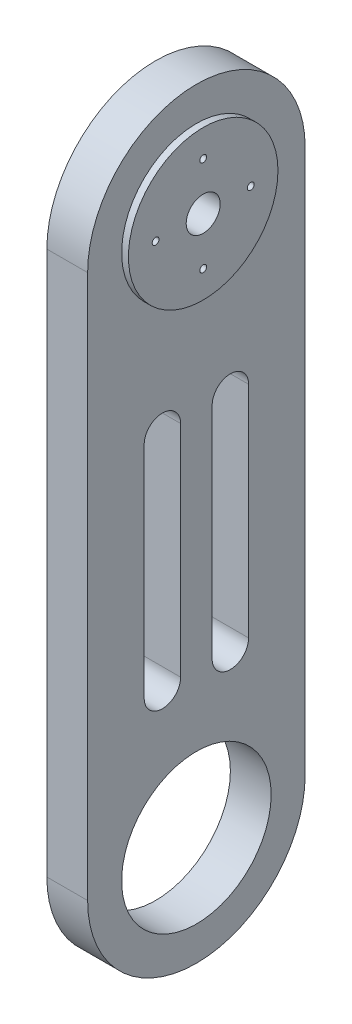
ISO-10303-21;
HEADER;
FILE_DESCRIPTION(('STEP AP214'),'2;1');
FILE_NAME('part.step','',(''),(''),'','','');
FILE_SCHEMA(('AUTOMOTIVE_DESIGN { 1 0 10303 214 1 1 1 1 }'));
ENDSEC;
DATA;
#1=APPLICATION_CONTEXT('core data for automotive mechanical design processes');
#2=APPLICATION_PROTOCOL_DEFINITION('international standard','automotive_design',2000,#1);
#3=PRODUCT_CONTEXT('',#1,'mechanical');
#4=PRODUCT('Part','Part','',(#3));
#5=PRODUCT_RELATED_PRODUCT_CATEGORY('part','',(#4));
#6=PRODUCT_DEFINITION_FORMATION('','',#4);
#7=PRODUCT_DEFINITION_CONTEXT('part definition',#1,'design');
#8=PRODUCT_DEFINITION('design','',#6,#7);
#9=PRODUCT_DEFINITION_SHAPE('','',#8);
#10=(LENGTH_UNIT() NAMED_UNIT(*) SI_UNIT(.MILLI.,.METRE.));
#11=(NAMED_UNIT(*) PLANE_ANGLE_UNIT() SI_UNIT($,.RADIAN.));
#12=(NAMED_UNIT(*) SI_UNIT($,.STERADIAN.) SOLID_ANGLE_UNIT());
#13=UNCERTAINTY_MEASURE_WITH_UNIT(LENGTH_MEASURE(1.E-05),#10,'distance_accuracy_value','');
#14=(GEOMETRIC_REPRESENTATION_CONTEXT(3) GLOBAL_UNCERTAINTY_ASSIGNED_CONTEXT((#13)) GLOBAL_UNIT_ASSIGNED_CONTEXT((#10,
#11,#12)) REPRESENTATION_CONTEXT('',''));
#15=CARTESIAN_POINT('',(0.,0.,0.));
#16=DIRECTION('',(0.,0.,1.));
#17=DIRECTION('',(1.,0.,0.));
#18=AXIS2_PLACEMENT_3D('',#15,#16,#17);
#19=CARTESIAN_POINT('',(-2.,0.,0.));
#20=DIRECTION('',(1.,0.,0.));
#21=DIRECTION('',(0.,0.,-1.));
#22=AXIS2_PLACEMENT_3D('',#19,#20,#21);
#23=PLANE('',#22);
#24=CARTESIAN_POINT('',(-2.,7.,0.));
#25=DIRECTION('',(-1.,0.,0.));
#26=DIRECTION('',(0.,0.,1.));
#27=AXIS2_PLACEMENT_3D('',#24,#25,#26);
#28=CIRCLE('',#27,0.5);
#29=CARTESIAN_POINT('',(-2.,7.,0.499999999999998));
#30=VERTEX_POINT('',#29);
#31=EDGE_CURVE('E312',#30,#30,#28,.T.);
#32=ORIENTED_EDGE('',*,*,#31,.F.);
#33=EDGE_LOOP('',(#32));
#34=FACE_BOUND('',#33,.T.);
#35=CARTESIAN_POINT('',(-2.,0.,-7.));
#36=DIRECTION('',(-1.,0.,0.));
#37=DIRECTION('',(0.,0.,1.));
#38=AXIS2_PLACEMENT_3D('',#35,#36,#37);
#39=CIRCLE('',#38,0.500000000000001);
#40=CARTESIAN_POINT('',(-2.,0.,-6.5));
#41=VERTEX_POINT('',#40);
#42=EDGE_CURVE('E413',#41,#41,#39,.T.);
#43=ORIENTED_EDGE('',*,*,#42,.F.);
#44=EDGE_LOOP('',(#43));
#45=FACE_BOUND('',#44,.T.);
#46=CARTESIAN_POINT('',(-2.,0.,7.));
#47=DIRECTION('',(-1.,0.,0.));
#48=DIRECTION('',(0.,0.,1.));
#49=AXIS2_PLACEMENT_3D('',#46,#47,#48);
#50=CIRCLE('',#49,0.500000000000001);
#51=CARTESIAN_POINT('',(-2.,0.,7.5));
#52=VERTEX_POINT('',#51);
#53=EDGE_CURVE('E412',#52,#52,#50,.T.);
#54=ORIENTED_EDGE('',*,*,#53,.F.);
#55=EDGE_LOOP('',(#54));
#56=FACE_BOUND('',#55,.T.);
#57=CARTESIAN_POINT('',(-2.,-7.,0.));
#58=DIRECTION('',(-1.,0.,0.));
#59=DIRECTION('',(0.,0.,1.));
#60=AXIS2_PLACEMENT_3D('',#57,#58,#59);
#61=CIRCLE('',#60,0.5);
#62=CARTESIAN_POINT('',(-2.,-7.,0.500000000000002));
#63=VERTEX_POINT('',#62);
#64=EDGE_CURVE('E418',#63,#63,#61,.T.);
#65=ORIENTED_EDGE('',*,*,#64,.F.);
#66=EDGE_LOOP('',(#65));
#67=FACE_BOUND('',#66,.T.);
#68=CARTESIAN_POINT('',(-2.,0.,0.));
#69=DIRECTION('',(1.,0.,0.));
#70=DIRECTION('',(0.,0.,-1.));
#71=AXIS2_PLACEMENT_3D('',#68,#69,#70);
#72=CIRCLE('',#71,11.);
#73=CARTESIAN_POINT('',(-2.,0.,-11.));
#74=VERTEX_POINT('',#73);
#75=EDGE_CURVE('E11',#74,#74,#72,.F.);
#76=ORIENTED_EDGE('',*,*,#75,.T.);
#77=EDGE_LOOP('',(#76));
#78=FACE_BOUND('',#77,.T.);
#79=CARTESIAN_POINT('',(-2.,0.,0.));
#80=DIRECTION('',(-1.,0.,0.));
#81=DIRECTION('',(0.,0.,1.));
#82=AXIS2_PLACEMENT_3D('',#79,#80,#81);
#83=CIRCLE('',#82,2.5);
#84=CARTESIAN_POINT('',(-2.,0.,2.5));
#85=VERTEX_POINT('',#84);
#86=EDGE_CURVE('E305',#85,#85,#83,.T.);
#87=ORIENTED_EDGE('',*,*,#86,.F.);
#88=EDGE_LOOP('',(#87));
#89=FACE_BOUND('',#88,.T.);
#90=ADVANCED_FACE('F38',(#34,#45,#56,#67,#78,#89),#23,.F.);
#91=CARTESIAN_POINT('',(-3.,0.,0.));
#92=DIRECTION('',(1.,0.,0.));
#93=DIRECTION('',(0.,0.,-1.));
#94=AXIS2_PLACEMENT_3D('',#91,#92,#93);
#95=CYLINDRICAL_SURFACE('',#94,11.);
#96=CARTESIAN_POINT('',(-3.,0.,0.));
#97=DIRECTION('',(1.,0.,0.));
#98=DIRECTION('',(0.,0.,-1.));
#99=AXIS2_PLACEMENT_3D('',#96,#97,#98);
#100=CIRCLE('',#99,11.);
#101=CARTESIAN_POINT('',(-3.,0.,-11.));
#102=VERTEX_POINT('',#101);
#103=EDGE_CURVE('E212',#102,#102,#100,.T.);
#104=ORIENTED_EDGE('',*,*,#103,.F.);
#105=EDGE_LOOP('',(#104));
#106=FACE_BOUND('',#105,.T.);
#107=ORIENTED_EDGE('',*,*,#75,.F.);
#108=EDGE_LOOP('',(#107));
#109=FACE_BOUND('',#108,.T.);
#110=ADVANCED_FACE('F259',(#106,#109),#95,.F.);
#111=CARTESIAN_POINT('',(-3.,-80.,0.));
#112=DIRECTION('',(1.,0.,0.));
#113=DIRECTION('',(0.,0.,-1.));
#114=AXIS2_PLACEMENT_3D('',#111,#112,#113);
#115=CYLINDRICAL_SURFACE('',#114,16.);
#116=DIRECTION('',(1.,0.,0.));
#117=VECTOR('',#116,1.);
#118=CARTESIAN_POINT('',(-3.,-80.,-16.));
#119=LINE('',#118,#117);
#120=CARTESIAN_POINT('',(-3.,-80.,-16.));
#121=VERTEX_POINT('',#120);
#122=CARTESIAN_POINT('',(3.,-80.,-16.));
#123=VERTEX_POINT('',#122);
#124=EDGE_CURVE('E227',#121,#123,#119,.T.);
#125=ORIENTED_EDGE('',*,*,#124,.T.);
#126=CARTESIAN_POINT('',(3.,-80.,0.));
#127=DIRECTION('',(1.,0.,0.));
#128=DIRECTION('',(0.,0.,-1.));
#129=AXIS2_PLACEMENT_3D('',#126,#127,#128);
#130=CIRCLE('',#129,16.);
#131=CARTESIAN_POINT('',(3.,-80.,16.));
#132=VERTEX_POINT('',#131);
#133=EDGE_CURVE('E197',#132,#123,#130,.T.);
#134=ORIENTED_EDGE('',*,*,#133,.F.);
#135=DIRECTION('',(1.,0.,0.));
#136=VECTOR('',#135,1.);
#137=CARTESIAN_POINT('',(-3.,-80.,16.));
#138=LINE('',#137,#136);
#139=CARTESIAN_POINT('',(-3.,-80.,16.));
#140=VERTEX_POINT('',#139);
#141=EDGE_CURVE('E46',#140,#132,#138,.T.);
#142=ORIENTED_EDGE('',*,*,#141,.F.);
#143=CARTESIAN_POINT('',(-3.,-80.,0.));
#144=DIRECTION('',(1.,0.,0.));
#145=DIRECTION('',(0.,0.,-1.));
#146=AXIS2_PLACEMENT_3D('',#143,#144,#145);
#147=CIRCLE('',#146,16.);
#148=EDGE_CURVE('E215',#140,#121,#147,.T.);
#149=ORIENTED_EDGE('',*,*,#148,.T.);
#150=EDGE_LOOP('',(#125,#134,#142,#149));
#151=FACE_BOUND('',#150,.T.);
#152=ADVANCED_FACE('F40',(#151),#115,.T.);
#153=CARTESIAN_POINT('',(-3.,0.,16.));
#154=DIRECTION('',(0.,0.,1.));
#155=DIRECTION('',(1.,0.,0.));
#156=AXIS2_PLACEMENT_3D('',#153,#154,#155);
#157=PLANE('',#156);
#158=ORIENTED_EDGE('',*,*,#141,.T.);
#159=DIRECTION('',(0.,-1.,0.));
#160=VECTOR('',#159,1.);
#161=CARTESIAN_POINT('',(3.,0.,16.));
#162=LINE('',#161,#160);
#163=CARTESIAN_POINT('',(3.,0.,16.));
#164=VERTEX_POINT('',#163);
#165=EDGE_CURVE('E206',#164,#132,#162,.T.);
#166=ORIENTED_EDGE('',*,*,#165,.F.);
#167=DIRECTION('',(1.,0.,0.));
#168=VECTOR('',#167,1.);
#169=CARTESIAN_POINT('',(-3.,0.,16.));
#170=LINE('',#169,#168);
#171=CARTESIAN_POINT('',(-3.,0.,16.));
#172=VERTEX_POINT('',#171);
#173=EDGE_CURVE('E229',#172,#164,#170,.T.);
#174=ORIENTED_EDGE('',*,*,#173,.F.);
#175=DIRECTION('',(0.,-1.,0.));
#176=VECTOR('',#175,1.);
#177=CARTESIAN_POINT('',(-3.,0.,16.));
#178=LINE('',#177,#176);
#179=EDGE_CURVE('E224',#172,#140,#178,.T.);
#180=ORIENTED_EDGE('',*,*,#179,.T.);
#181=EDGE_LOOP('',(#158,#166,#174,#180));
#182=FACE_BOUND('',#181,.T.);
#183=ADVANCED_FACE('F244',(#182),#157,.T.);
#184=CARTESIAN_POINT('',(-3.,0.,0.));
#185=DIRECTION('',(1.,0.,0.));
#186=DIRECTION('',(0.,0.,-1.));
#187=AXIS2_PLACEMENT_3D('',#184,#185,#186);
#188=CYLINDRICAL_SURFACE('',#187,16.);
#189=ORIENTED_EDGE('',*,*,#173,.T.);
#190=CARTESIAN_POINT('',(3.,0.,0.));
#191=DIRECTION('',(1.,0.,0.));
#192=DIRECTION('',(0.,0.,-1.));
#193=AXIS2_PLACEMENT_3D('',#190,#191,#192);
#194=CIRCLE('',#193,16.);
#195=CARTESIAN_POINT('',(3.,0.,-16.));
#196=VERTEX_POINT('',#195);
#197=EDGE_CURVE('E203',#196,#164,#194,.T.);
#198=ORIENTED_EDGE('',*,*,#197,.F.);
#199=DIRECTION('',(1.,0.,0.));
#200=VECTOR('',#199,1.);
#201=CARTESIAN_POINT('',(-3.,0.,-16.));
#202=LINE('',#201,#200);
#203=CARTESIAN_POINT('',(-3.,0.,-16.));
#204=VERTEX_POINT('',#203);
#205=EDGE_CURVE('E231',#204,#196,#202,.T.);
#206=ORIENTED_EDGE('',*,*,#205,.F.);
#207=CARTESIAN_POINT('',(-3.,0.,0.));
#208=DIRECTION('',(1.,0.,0.));
#209=DIRECTION('',(0.,0.,-1.));
#210=AXIS2_PLACEMENT_3D('',#207,#208,#209);
#211=CIRCLE('',#210,16.);
#212=EDGE_CURVE('E221',#204,#172,#211,.T.);
#213=ORIENTED_EDGE('',*,*,#212,.T.);
#214=EDGE_LOOP('',(#189,#198,#206,#213));
#215=FACE_BOUND('',#214,.T.);
#216=ADVANCED_FACE('F250',(#215),#188,.T.);
#217=CARTESIAN_POINT('',(-3.,0.,-16.));
#218=DIRECTION('',(0.,0.,-1.));
#219=DIRECTION('',(0.,1.,0.));
#220=AXIS2_PLACEMENT_3D('',#217,#218,#219);
#221=PLANE('',#220);
#222=ORIENTED_EDGE('',*,*,#205,.T.);
#223=DIRECTION('',(0.,1.,0.));
#224=VECTOR('',#223,1.);
#225=CARTESIAN_POINT('',(3.,0.,-16.));
#226=LINE('',#225,#224);
#227=EDGE_CURVE('E200',#123,#196,#226,.T.);
#228=ORIENTED_EDGE('',*,*,#227,.F.);
#229=ORIENTED_EDGE('',*,*,#124,.F.);
#230=DIRECTION('',(0.,1.,0.));
#231=VECTOR('',#230,1.);
#232=CARTESIAN_POINT('',(-3.,0.,-16.));
#233=LINE('',#232,#231);
#234=EDGE_CURVE('E218',#121,#204,#233,.T.);
#235=ORIENTED_EDGE('',*,*,#234,.T.);
#236=EDGE_LOOP('',(#222,#228,#229,#235));
#237=FACE_BOUND('',#236,.T.);
#238=ADVANCED_FACE('F238',(#237),#221,.T.);
#239=CARTESIAN_POINT('',(-3.,-80.,0.));
#240=DIRECTION('',(1.,0.,0.));
#241=DIRECTION('',(0.,0.,-1.));
#242=AXIS2_PLACEMENT_3D('',#239,#240,#241);
#243=PLANE('',#242);
#244=DIRECTION('',(0.,-1.,0.));
#245=VECTOR('',#244,1.);
#246=CARTESIAN_POINT('',(-3.,-26.0714468281345,2.3175977370678));
#247=LINE('',#246,#245);
#248=CARTESIAN_POINT('',(-3.,-26.0714468281345,2.3175977370678));
#249=VERTEX_POINT('',#248);
#250=CARTESIAN_POINT('',(-3.,-58.3822013589087,2.3175977370678));
#251=VERTEX_POINT('',#250);
#252=EDGE_CURVE('E291',#249,#251,#247,.T.);
#253=ORIENTED_EDGE('',*,*,#252,.F.);
#254=CARTESIAN_POINT('',(-3.,-26.0714468281345,5.));
#255=DIRECTION('',(1.,0.,0.));
#256=DIRECTION('',(0.,0.,-1.));
#257=AXIS2_PLACEMENT_3D('',#254,#255,#256);
#258=CIRCLE('',#257,2.6824022629322);
#259=CARTESIAN_POINT('',(-3.,-26.0714468281345,7.68240226293219));
#260=VERTEX_POINT('',#259);
#261=EDGE_CURVE('E161',#260,#249,#258,.F.);
#262=ORIENTED_EDGE('',*,*,#261,.F.);
#263=DIRECTION('',(0.,1.,0.));
#264=VECTOR('',#263,1.);
#265=CARTESIAN_POINT('',(-3.,-26.0714468281345,7.68240226293219));
#266=LINE('',#265,#264);
#267=CARTESIAN_POINT('',(-3.,-58.3822013589087,7.68240226293219));
#268=VERTEX_POINT('',#267);
#269=EDGE_CURVE('E158',#268,#260,#266,.T.);
#270=ORIENTED_EDGE('',*,*,#269,.F.);
#271=CARTESIAN_POINT('',(-3.,-58.3822013589087,4.99999999999999));
#272=DIRECTION('',(1.,0.,0.));
#273=DIRECTION('',(0.,0.,-1.));
#274=AXIS2_PLACEMENT_3D('',#271,#272,#273);
#275=CIRCLE('',#274,2.6824022629322);
#276=EDGE_CURVE('E132',#251,#268,#275,.F.);
#277=ORIENTED_EDGE('',*,*,#276,.F.);
#278=EDGE_LOOP('',(#253,#262,#270,#277));
#279=FACE_BOUND('',#278,.T.);
#280=DIRECTION('',(0.,-1.,0.));
#281=VECTOR('',#280,1.);
#282=CARTESIAN_POINT('',(-3.,-26.0714468281345,-7.6824022629322));
#283=LINE('',#282,#281);
#284=CARTESIAN_POINT('',(-3.,-26.0714468281345,-7.6824022629322));
#285=VERTEX_POINT('',#284);
#286=CARTESIAN_POINT('',(-3.,-58.3822013589087,-7.68240226293221));
#287=VERTEX_POINT('',#286);
#288=EDGE_CURVE('E164',#285,#287,#283,.T.);
#289=ORIENTED_EDGE('',*,*,#288,.F.);
#290=CARTESIAN_POINT('',(-3.,-26.0714468281345,-5.));
#291=DIRECTION('',(1.,0.,0.));
#292=DIRECTION('',(0.,0.,-1.));
#293=AXIS2_PLACEMENT_3D('',#290,#291,#292);
#294=CIRCLE('',#293,2.6824022629322);
#295=CARTESIAN_POINT('',(-3.,-26.0714468281345,-2.31759773706781));
#296=VERTEX_POINT('',#295);
#297=EDGE_CURVE('E167',#296,#285,#294,.F.);
#298=ORIENTED_EDGE('',*,*,#297,.F.);
#299=DIRECTION('',(0.,1.,0.));
#300=VECTOR('',#299,1.);
#301=CARTESIAN_POINT('',(-3.,-26.0714468281345,-2.31759773706781));
#302=LINE('',#301,#300);
#303=CARTESIAN_POINT('',(-3.,-58.3822013589087,-2.31759773706781));
#304=VERTEX_POINT('',#303);
#305=EDGE_CURVE('E169',#304,#296,#302,.T.);
#306=ORIENTED_EDGE('',*,*,#305,.F.);
#307=CARTESIAN_POINT('',(-3.,-58.3822013589087,-5.00000000000001));
#308=DIRECTION('',(1.,0.,0.));
#309=DIRECTION('',(0.,0.,-1.));
#310=AXIS2_PLACEMENT_3D('',#307,#308,#309);
#311=CIRCLE('',#310,2.6824022629322);
#312=EDGE_CURVE('E162',#287,#304,#311,.F.);
#313=ORIENTED_EDGE('',*,*,#312,.F.);
#314=EDGE_LOOP('',(#289,#298,#306,#313));
#315=FACE_BOUND('',#314,.T.);
#316=CARTESIAN_POINT('',(-3.,-80.,0.));
#317=DIRECTION('',(1.,0.,0.));
#318=DIRECTION('',(0.,0.,-1.));
#319=AXIS2_PLACEMENT_3D('',#316,#317,#318);
#320=CIRCLE('',#319,11.);
#321=CARTESIAN_POINT('',(-3.,-80.,-11.));
#322=VERTEX_POINT('',#321);
#323=EDGE_CURVE('E209',#322,#322,#320,.T.);
#324=ORIENTED_EDGE('',*,*,#323,.T.);
#325=EDGE_LOOP('',(#324));
#326=FACE_BOUND('',#325,.T.);
#327=ORIENTED_EDGE('',*,*,#103,.T.);
#328=EDGE_LOOP('',(#327));
#329=FACE_BOUND('',#328,.T.);
#330=ORIENTED_EDGE('',*,*,#148,.F.);
#331=ORIENTED_EDGE('',*,*,#179,.F.);
#332=ORIENTED_EDGE('',*,*,#212,.F.);
#333=ORIENTED_EDGE('',*,*,#234,.F.);
#334=EDGE_LOOP('',(#330,#331,#332,#333));
#335=FACE_BOUND('',#334,.T.);
#336=ADVANCED_FACE('F247',(#279,#315,#326,#329,#335),#243,.F.);
#337=CARTESIAN_POINT('',(-3.,-80.,0.));
#338=DIRECTION('',(1.,0.,0.));
#339=DIRECTION('',(0.,0.,-1.));
#340=AXIS2_PLACEMENT_3D('',#337,#338,#339);
#341=CYLINDRICAL_SURFACE('',#340,11.);
#342=ORIENTED_EDGE('',*,*,#323,.F.);
#343=EDGE_LOOP('',(#342));
#344=FACE_BOUND('',#343,.T.);
#345=CARTESIAN_POINT('',(3.,-80.,0.));
#346=DIRECTION('',(1.,0.,0.));
#347=DIRECTION('',(0.,0.,-1.));
#348=AXIS2_PLACEMENT_3D('',#345,#346,#347);
#349=CIRCLE('',#348,11.);
#350=CARTESIAN_POINT('',(3.,-80.,-11.));
#351=VERTEX_POINT('',#350);
#352=EDGE_CURVE('E191',#351,#351,#349,.T.);
#353=ORIENTED_EDGE('',*,*,#352,.T.);
#354=EDGE_LOOP('',(#353));
#355=FACE_BOUND('',#354,.T.);
#356=ADVANCED_FACE('F280',(#344,#355),#341,.F.);
#357=CARTESIAN_POINT('',(3.,-80.,0.));
#358=DIRECTION('',(1.,0.,0.));
#359=DIRECTION('',(0.,0.,-1.));
#360=AXIS2_PLACEMENT_3D('',#357,#358,#359);
#361=PLANE('',#360);
#362=CARTESIAN_POINT('',(3.,-26.0714468281345,5.));
#363=DIRECTION('',(1.,0.,0.));
#364=DIRECTION('',(0.,0.,-1.));
#365=AXIS2_PLACEMENT_3D('',#362,#363,#364);
#366=CIRCLE('',#365,2.6824022629322);
#367=CARTESIAN_POINT('',(3.,-26.0714468281345,2.3175977370678));
#368=VERTEX_POINT('',#367);
#369=CARTESIAN_POINT('',(3.,-26.0714468281345,7.68240226293219));
#370=VERTEX_POINT('',#369);
#371=EDGE_CURVE('E144',#368,#370,#366,.T.);
#372=ORIENTED_EDGE('',*,*,#371,.F.);
#373=DIRECTION('',(0.,1.,0.));
#374=VECTOR('',#373,1.);
#375=CARTESIAN_POINT('',(3.,-26.0714468281345,2.3175977370678));
#376=LINE('',#375,#374);
#377=CARTESIAN_POINT('',(3.,-58.3822013589087,2.3175977370678));
#378=VERTEX_POINT('',#377);
#379=EDGE_CURVE('E149',#378,#368,#376,.T.);
#380=ORIENTED_EDGE('',*,*,#379,.F.);
#381=CARTESIAN_POINT('',(3.,-58.3822013589087,4.99999999999999));
#382=DIRECTION('',(1.,0.,0.));
#383=DIRECTION('',(0.,0.,-1.));
#384=AXIS2_PLACEMENT_3D('',#381,#382,#383);
#385=CIRCLE('',#384,2.6824022629322);
#386=CARTESIAN_POINT('',(3.,-58.3822013589087,7.68240226293219));
#387=VERTEX_POINT('',#386);
#388=EDGE_CURVE('E129',#387,#378,#385,.T.);
#389=ORIENTED_EDGE('',*,*,#388,.F.);
#390=DIRECTION('',(0.,-1.,0.));
#391=VECTOR('',#390,1.);
#392=CARTESIAN_POINT('',(3.,-26.0714468281345,7.68240226293219));
#393=LINE('',#392,#391);
#394=EDGE_CURVE('E139',#370,#387,#393,.T.);
#395=ORIENTED_EDGE('',*,*,#394,.F.);
#396=EDGE_LOOP('',(#372,#380,#389,#395));
#397=FACE_BOUND('',#396,.T.);
#398=CARTESIAN_POINT('',(3.,-26.0714468281345,-5.));
#399=DIRECTION('',(1.,0.,0.));
#400=DIRECTION('',(0.,0.,1.));
#401=AXIS2_PLACEMENT_3D('',#398,#399,#400);
#402=CIRCLE('',#401,2.6824022629322);
#403=CARTESIAN_POINT('',(3.,-26.0714468281345,-7.6824022629322));
#404=VERTEX_POINT('',#403);
#405=CARTESIAN_POINT('',(3.,-26.0714468281345,-2.31759773706781));
#406=VERTEX_POINT('',#405);
#407=EDGE_CURVE('E170',#404,#406,#402,.T.);
#408=ORIENTED_EDGE('',*,*,#407,.F.);
#409=DIRECTION('',(0.,1.,0.));
#410=VECTOR('',#409,1.);
#411=CARTESIAN_POINT('',(3.,-26.0714468281345,-7.6824022629322));
#412=LINE('',#411,#410);
#413=CARTESIAN_POINT('',(3.,-58.3822013589087,-7.68240226293221));
#414=VERTEX_POINT('',#413);
#415=EDGE_CURVE('E178',#414,#404,#412,.T.);
#416=ORIENTED_EDGE('',*,*,#415,.F.);
#417=CARTESIAN_POINT('',(3.,-58.3822013589087,-5.00000000000001));
#418=DIRECTION('',(1.,0.,0.));
#419=DIRECTION('',(0.,0.,1.));
#420=AXIS2_PLACEMENT_3D('',#417,#418,#419);
#421=CIRCLE('',#420,2.6824022629322);
#422=CARTESIAN_POINT('',(3.,-58.3822013589087,-2.31759773706781));
#423=VERTEX_POINT('',#422);
#424=EDGE_CURVE('E175',#423,#414,#421,.T.);
#425=ORIENTED_EDGE('',*,*,#424,.F.);
#426=DIRECTION('',(0.,-1.,0.));
#427=VECTOR('',#426,1.);
#428=CARTESIAN_POINT('',(3.,-26.0714468281345,-2.31759773706781));
#429=LINE('',#428,#427);
#430=EDGE_CURVE('E172',#406,#423,#429,.T.);
#431=ORIENTED_EDGE('',*,*,#430,.F.);
#432=EDGE_LOOP('',(#408,#416,#425,#431));
#433=FACE_BOUND('',#432,.T.);
#434=CARTESIAN_POINT('',(3.,0.,0.));
#435=DIRECTION('',(1.,0.,0.));
#436=DIRECTION('',(0.,0.,-1.));
#437=AXIS2_PLACEMENT_3D('',#434,#435,#436);
#438=CIRCLE('',#437,11.);
#439=CARTESIAN_POINT('',(3.,0.,-11.));
#440=VERTEX_POINT('',#439);
#441=EDGE_CURVE('E194',#440,#440,#438,.T.);
#442=ORIENTED_EDGE('',*,*,#441,.F.);
#443=EDGE_LOOP('',(#442));
#444=FACE_BOUND('',#443,.T.);
#445=ORIENTED_EDGE('',*,*,#133,.T.);
#446=ORIENTED_EDGE('',*,*,#227,.T.);
#447=ORIENTED_EDGE('',*,*,#197,.T.);
#448=ORIENTED_EDGE('',*,*,#165,.T.);
#449=EDGE_LOOP('',(#445,#446,#447,#448));
#450=FACE_BOUND('',#449,.T.);
#451=ORIENTED_EDGE('',*,*,#352,.F.);
#452=EDGE_LOOP('',(#451));
#453=FACE_BOUND('',#452,.T.);
#454=ADVANCED_FACE('F146',(#397,#433,#444,#450,#453),#361,.T.);
#455=CARTESIAN_POINT('',(4.,0.,0.));
#456=DIRECTION('',(1.,0.,0.));
#457=DIRECTION('',(0.,0.,-1.));
#458=AXIS2_PLACEMENT_3D('',#455,#456,#457);
#459=PLANE('',#458);
#460=CARTESIAN_POINT('',(4.,7.,0.));
#461=DIRECTION('',(1.,0.,0.));
#462=DIRECTION('',(0.,0.,-1.));
#463=AXIS2_PLACEMENT_3D('',#460,#461,#462);
#464=CIRCLE('',#463,0.5);
#465=CARTESIAN_POINT('',(4.,7.,-0.500000000000003));
#466=VERTEX_POINT('',#465);
#467=EDGE_CURVE('E307',#466,#466,#464,.F.);
#468=ORIENTED_EDGE('',*,*,#467,.T.);
#469=EDGE_LOOP('',(#468));
#470=FACE_BOUND('',#469,.T.);
#471=CARTESIAN_POINT('',(4.,0.,-7.));
#472=DIRECTION('',(1.,0.,0.));
#473=DIRECTION('',(0.,0.,-1.));
#474=AXIS2_PLACEMENT_3D('',#471,#472,#473);
#475=CIRCLE('',#474,0.500000000000001);
#476=CARTESIAN_POINT('',(4.,0.,-7.5));
#477=VERTEX_POINT('',#476);
#478=EDGE_CURVE('E315',#477,#477,#475,.F.);
#479=ORIENTED_EDGE('',*,*,#478,.T.);
#480=EDGE_LOOP('',(#479));
#481=FACE_BOUND('',#480,.T.);
#482=CARTESIAN_POINT('',(4.,0.,7.));
#483=DIRECTION('',(1.,0.,0.));
#484=DIRECTION('',(0.,0.,-1.));
#485=AXIS2_PLACEMENT_3D('',#482,#483,#484);
#486=CIRCLE('',#485,0.500000000000001);
#487=CARTESIAN_POINT('',(4.,0.,6.5));
#488=VERTEX_POINT('',#487);
#489=EDGE_CURVE('E379',#488,#488,#486,.F.);
#490=ORIENTED_EDGE('',*,*,#489,.T.);
#491=EDGE_LOOP('',(#490));
#492=FACE_BOUND('',#491,.T.);
#493=CARTESIAN_POINT('',(4.,-7.,0.));
#494=DIRECTION('',(1.,0.,0.));
#495=DIRECTION('',(0.,0.,-1.));
#496=AXIS2_PLACEMENT_3D('',#493,#494,#495);
#497=CIRCLE('',#496,0.5);
#498=CARTESIAN_POINT('',(4.,-7.,-0.499999999999998));
#499=VERTEX_POINT('',#498);
#500=EDGE_CURVE('E383',#499,#499,#497,.F.);
#501=ORIENTED_EDGE('',*,*,#500,.T.);
#502=EDGE_LOOP('',(#501));
#503=FACE_BOUND('',#502,.T.);
#504=CARTESIAN_POINT('',(4.,0.,0.));
#505=DIRECTION('',(1.,0.,0.));
#506=DIRECTION('',(0.,0.,-1.));
#507=AXIS2_PLACEMENT_3D('',#504,#505,#506);
#508=CIRCLE('',#507,2.5);
#509=CARTESIAN_POINT('',(4.,0.,2.5));
#510=VERTEX_POINT('',#509);
#511=EDGE_CURVE('E173',#510,#510,#508,.F.);
#512=ORIENTED_EDGE('',*,*,#511,.T.);
#513=EDGE_LOOP('',(#512));
#514=FACE_BOUND('',#513,.T.);
#515=CARTESIAN_POINT('',(4.,0.,0.));
#516=DIRECTION('',(1.,0.,0.));
#517=DIRECTION('',(0.,0.,-1.));
#518=AXIS2_PLACEMENT_3D('',#515,#516,#517);
#519=CIRCLE('',#518,11.);
#520=CARTESIAN_POINT('',(4.,0.,-11.));
#521=VERTEX_POINT('',#520);
#522=EDGE_CURVE('E160',#521,#521,#519,.T.);
#523=ORIENTED_EDGE('',*,*,#522,.T.);
#524=EDGE_LOOP('',(#523));
#525=FACE_BOUND('',#524,.T.);
#526=ADVANCED_FACE('F271',(#470,#481,#492,#503,#514,#525),#459,.T.);
#527=CARTESIAN_POINT('',(-2.,0.,0.));
#528=DIRECTION('',(1.,0.,0.));
#529=DIRECTION('',(0.,0.,-1.));
#530=AXIS2_PLACEMENT_3D('',#527,#528,#529);
#531=CYLINDRICAL_SURFACE('',#530,11.);
#532=ORIENTED_EDGE('',*,*,#441,.T.);
#533=EDGE_LOOP('',(#532));
#534=FACE_BOUND('',#533,.T.);
#535=ORIENTED_EDGE('',*,*,#522,.F.);
#536=EDGE_LOOP('',(#535));
#537=FACE_BOUND('',#536,.T.);
#538=ADVANCED_FACE('F273',(#534,#537),#531,.T.);
#539=CARTESIAN_POINT('',(-41.0556024499809,-26.0714468281345,-5.));
#540=DIRECTION('',(1.,0.,0.));
#541=DIRECTION('',(0.,0.,-1.));
#542=AXIS2_PLACEMENT_3D('',#539,#540,#541);
#543=CYLINDRICAL_SURFACE('',#542,2.6824022629322);
#544=ORIENTED_EDGE('',*,*,#297,.T.);
#545=DIRECTION('',(1.,0.,0.));
#546=VECTOR('',#545,1.);
#547=CARTESIAN_POINT('',(-41.0556024499809,-26.0714468281345,-7.6824022629322));
#548=LINE('',#547,#546);
#549=EDGE_CURVE('E165',#285,#404,#548,.T.);
#550=ORIENTED_EDGE('',*,*,#549,.T.);
#551=ORIENTED_EDGE('',*,*,#407,.T.);
#552=DIRECTION('',(1.,0.,0.));
#553=VECTOR('',#552,1.);
#554=CARTESIAN_POINT('',(-41.0556024499809,-26.0714468281345,-2.31759773706781));
#555=LINE('',#554,#553);
#556=EDGE_CURVE('E181',#296,#406,#555,.T.);
#557=ORIENTED_EDGE('',*,*,#556,.F.);
#558=EDGE_LOOP('',(#544,#550,#551,#557));
#559=FACE_BOUND('',#558,.T.);
#560=ADVANCED_FACE('F276',(#559),#543,.F.);
#561=CARTESIAN_POINT('',(-41.0556024499809,-26.0714468281345,-7.6824022629322));
#562=DIRECTION('',(0.,0.,-1.));
#563=DIRECTION('',(0.,1.,0.));
#564=AXIS2_PLACEMENT_3D('',#561,#562,#563);
#565=PLANE('',#564);
#566=ORIENTED_EDGE('',*,*,#288,.T.);
#567=DIRECTION('',(1.,0.,0.));
#568=VECTOR('',#567,1.);
#569=CARTESIAN_POINT('',(-41.0556024499809,-58.3822013589087,-7.68240226293221));
#570=LINE('',#569,#568);
#571=EDGE_CURVE('E183',#287,#414,#570,.T.);
#572=ORIENTED_EDGE('',*,*,#571,.T.);
#573=ORIENTED_EDGE('',*,*,#415,.T.);
#574=ORIENTED_EDGE('',*,*,#549,.F.);
#575=EDGE_LOOP('',(#566,#572,#573,#574));
#576=FACE_BOUND('',#575,.T.);
#577=ADVANCED_FACE('F341',(#576),#565,.F.);
#578=CARTESIAN_POINT('',(-41.0556024499809,-58.3822013589087,-5.00000000000001));
#579=DIRECTION('',(1.,0.,0.));
#580=DIRECTION('',(0.,0.,-1.));
#581=AXIS2_PLACEMENT_3D('',#578,#579,#580);
#582=CYLINDRICAL_SURFACE('',#581,2.6824022629322);
#583=ORIENTED_EDGE('',*,*,#312,.T.);
#584=DIRECTION('',(1.,0.,0.));
#585=VECTOR('',#584,1.);
#586=CARTESIAN_POINT('',(-41.0556024499809,-58.3822013589087,-2.31759773706781));
#587=LINE('',#586,#585);
#588=EDGE_CURVE('E61',#304,#423,#587,.T.);
#589=ORIENTED_EDGE('',*,*,#588,.T.);
#590=ORIENTED_EDGE('',*,*,#424,.T.);
#591=ORIENTED_EDGE('',*,*,#571,.F.);
#592=EDGE_LOOP('',(#583,#589,#590,#591));
#593=FACE_BOUND('',#592,.T.);
#594=ADVANCED_FACE('F344',(#593),#582,.F.);
#595=CARTESIAN_POINT('',(-41.0556024499809,-26.0714468281345,-2.31759773706781));
#596=DIRECTION('',(0.,0.,1.));
#597=DIRECTION('',(0.,-1.,0.));
#598=AXIS2_PLACEMENT_3D('',#595,#596,#597);
#599=PLANE('',#598);
#600=ORIENTED_EDGE('',*,*,#305,.T.);
#601=ORIENTED_EDGE('',*,*,#556,.T.);
#602=ORIENTED_EDGE('',*,*,#430,.T.);
#603=ORIENTED_EDGE('',*,*,#588,.F.);
#604=EDGE_LOOP('',(#600,#601,#602,#603));
#605=FACE_BOUND('',#604,.T.);
#606=ADVANCED_FACE('F332',(#605),#599,.F.);
#607=CARTESIAN_POINT('',(-41.0556024499809,-26.0714468281345,5.));
#608=DIRECTION('',(1.,0.,0.));
#609=DIRECTION('',(0.,0.,-1.));
#610=AXIS2_PLACEMENT_3D('',#607,#608,#609);
#611=CYLINDRICAL_SURFACE('',#610,2.6824022629322);
#612=ORIENTED_EDGE('',*,*,#261,.T.);
#613=DIRECTION('',(1.,0.,0.));
#614=VECTOR('',#613,1.);
#615=CARTESIAN_POINT('',(-41.0556024499809,-26.0714468281345,2.3175977370678));
#616=LINE('',#615,#614);
#617=EDGE_CURVE('E154',#249,#368,#616,.T.);
#618=ORIENTED_EDGE('',*,*,#617,.T.);
#619=ORIENTED_EDGE('',*,*,#371,.T.);
#620=DIRECTION('',(1.,0.,0.));
#621=VECTOR('',#620,1.);
#622=CARTESIAN_POINT('',(-41.0556024499809,-26.0714468281345,7.68240226293219));
#623=LINE('',#622,#621);
#624=EDGE_CURVE('E135',#260,#370,#623,.T.);
#625=ORIENTED_EDGE('',*,*,#624,.F.);
#626=EDGE_LOOP('',(#612,#618,#619,#625));
#627=FACE_BOUND('',#626,.T.);
#628=ADVANCED_FACE('F321',(#627),#611,.F.);
#629=CARTESIAN_POINT('',(-41.0556024499809,-26.0714468281345,2.3175977370678));
#630=DIRECTION('',(0.,0.,-1.));
#631=DIRECTION('',(0.,1.,0.));
#632=AXIS2_PLACEMENT_3D('',#629,#630,#631);
#633=PLANE('',#632);
#634=ORIENTED_EDGE('',*,*,#252,.T.);
#635=DIRECTION('',(1.,0.,0.));
#636=VECTOR('',#635,1.);
#637=CARTESIAN_POINT('',(-41.0556024499809,-58.3822013589087,2.3175977370678));
#638=LINE('',#637,#636);
#639=EDGE_CURVE('E134',#251,#378,#638,.T.);
#640=ORIENTED_EDGE('',*,*,#639,.T.);
#641=ORIENTED_EDGE('',*,*,#379,.T.);
#642=ORIENTED_EDGE('',*,*,#617,.F.);
#643=EDGE_LOOP('',(#634,#640,#641,#642));
#644=FACE_BOUND('',#643,.T.);
#645=ADVANCED_FACE('F324',(#644),#633,.F.);
#646=CARTESIAN_POINT('',(-41.0556024499809,-58.3822013589087,4.99999999999999));
#647=DIRECTION('',(1.,0.,0.));
#648=DIRECTION('',(0.,0.,-1.));
#649=AXIS2_PLACEMENT_3D('',#646,#647,#648);
#650=CYLINDRICAL_SURFACE('',#649,2.6824022629322);
#651=ORIENTED_EDGE('',*,*,#276,.T.);
#652=DIRECTION('',(1.,0.,0.));
#653=VECTOR('',#652,1.);
#654=CARTESIAN_POINT('',(-41.0556024499809,-58.3822013589087,7.68240226293219));
#655=LINE('',#654,#653);
#656=EDGE_CURVE('E53',#268,#387,#655,.T.);
#657=ORIENTED_EDGE('',*,*,#656,.T.);
#658=ORIENTED_EDGE('',*,*,#388,.T.);
#659=ORIENTED_EDGE('',*,*,#639,.F.);
#660=EDGE_LOOP('',(#651,#657,#658,#659));
#661=FACE_BOUND('',#660,.T.);
#662=ADVANCED_FACE('F126',(#661),#650,.F.);
#663=CARTESIAN_POINT('',(-41.0556024499809,-26.0714468281345,7.68240226293219));
#664=DIRECTION('',(0.,0.,1.));
#665=DIRECTION('',(0.,-1.,0.));
#666=AXIS2_PLACEMENT_3D('',#663,#664,#665);
#667=PLANE('',#666);
#668=ORIENTED_EDGE('',*,*,#269,.T.);
#669=ORIENTED_EDGE('',*,*,#624,.T.);
#670=ORIENTED_EDGE('',*,*,#394,.T.);
#671=ORIENTED_EDGE('',*,*,#656,.F.);
#672=EDGE_LOOP('',(#668,#669,#670,#671));
#673=FACE_BOUND('',#672,.T.);
#674=ADVANCED_FACE('F140',(#673),#667,.F.);
#675=CARTESIAN_POINT('',(11.0710678118655,-7.,0.));
#676=DIRECTION('',(-1.,0.,0.));
#677=DIRECTION('',(0.,0.,1.));
#678=AXIS2_PLACEMENT_3D('',#675,#676,#677);
#679=CYLINDRICAL_SURFACE('',#678,0.5);
#680=ORIENTED_EDGE('',*,*,#64,.T.);
#681=EDGE_LOOP('',(#680));
#682=FACE_BOUND('',#681,.T.);
#683=ORIENTED_EDGE('',*,*,#500,.F.);
#684=EDGE_LOOP('',(#683));
#685=FACE_BOUND('',#684,.T.);
#686=ADVANCED_FACE('F339',(#682,#685),#679,.F.);
#687=CARTESIAN_POINT('',(11.0710678118655,0.,7.));
#688=DIRECTION('',(-1.,0.,0.));
#689=DIRECTION('',(0.,0.,1.));
#690=AXIS2_PLACEMENT_3D('',#687,#688,#689);
#691=CYLINDRICAL_SURFACE('',#690,0.500000000000001);
#692=ORIENTED_EDGE('',*,*,#53,.T.);
#693=EDGE_LOOP('',(#692));
#694=FACE_BOUND('',#693,.T.);
#695=ORIENTED_EDGE('',*,*,#489,.F.);
#696=EDGE_LOOP('',(#695));
#697=FACE_BOUND('',#696,.T.);
#698=ADVANCED_FACE('F397',(#694,#697),#691,.F.);
#699=CARTESIAN_POINT('',(11.0710678118655,0.,-7.));
#700=DIRECTION('',(-1.,0.,0.));
#701=DIRECTION('',(0.,0.,1.));
#702=AXIS2_PLACEMENT_3D('',#699,#700,#701);
#703=CYLINDRICAL_SURFACE('',#702,0.500000000000001);
#704=ORIENTED_EDGE('',*,*,#42,.T.);
#705=EDGE_LOOP('',(#704));
#706=FACE_BOUND('',#705,.T.);
#707=ORIENTED_EDGE('',*,*,#478,.F.);
#708=EDGE_LOOP('',(#707));
#709=FACE_BOUND('',#708,.T.);
#710=ADVANCED_FACE('F391',(#706,#709),#703,.F.);
#711=CARTESIAN_POINT('',(11.0710678118655,7.,0.));
#712=DIRECTION('',(-1.,0.,0.));
#713=DIRECTION('',(0.,0.,1.));
#714=AXIS2_PLACEMENT_3D('',#711,#712,#713);
#715=CYLINDRICAL_SURFACE('',#714,0.5);
#716=ORIENTED_EDGE('',*,*,#31,.T.);
#717=EDGE_LOOP('',(#716));
#718=FACE_BOUND('',#717,.T.);
#719=ORIENTED_EDGE('',*,*,#467,.F.);
#720=EDGE_LOOP('',(#719));
#721=FACE_BOUND('',#720,.T.);
#722=ADVANCED_FACE('F387',(#718,#721),#715,.F.);
#723=CARTESIAN_POINT('',(11.0710678118655,0.,0.));
#724=DIRECTION('',(-1.,0.,0.));
#725=DIRECTION('',(0.,0.,1.));
#726=AXIS2_PLACEMENT_3D('',#723,#724,#725);
#727=CYLINDRICAL_SURFACE('',#726,2.5);
#728=CARTESIAN_POINT('',(-2.,0.,2.5));
#729=CARTESIAN_POINT('',(-1.9375,0.,2.5));
#730=CARTESIAN_POINT('',(-1.875,0.,2.5));
#731=CARTESIAN_POINT('',(-1.75,0.,2.5));
#732=CARTESIAN_POINT('',(-1.6875,0.,2.5));
#733=CARTESIAN_POINT('',(-1.5625,0.,2.5));
#734=CARTESIAN_POINT('',(-1.5,0.,2.5));
#735=CARTESIAN_POINT('',(-1.375,0.,2.5));
#736=CARTESIAN_POINT('',(-1.3125,0.,2.5));
#737=CARTESIAN_POINT('',(-1.1875,0.,2.5));
#738=CARTESIAN_POINT('',(-1.125,0.,2.5));
#739=CARTESIAN_POINT('',(-0.999999999999999,0.,2.5));
#740=CARTESIAN_POINT('',(-0.937499999999999,0.,2.5));
#741=CARTESIAN_POINT('',(-0.8125,0.,2.5));
#742=CARTESIAN_POINT('',(-0.75,0.,2.5));
#743=CARTESIAN_POINT('',(-0.625000000000001,0.,2.5));
#744=CARTESIAN_POINT('',(-0.5625,0.,2.5));
#745=CARTESIAN_POINT('',(-0.4375,0.,2.5));
#746=CARTESIAN_POINT('',(-0.375,0.,2.5));
#747=CARTESIAN_POINT('',(-0.25,0.,2.5));
#748=CARTESIAN_POINT('',(-0.1875,0.,2.5));
#749=CARTESIAN_POINT('',(-0.0625000000000001,0.,2.5));
#750=CARTESIAN_POINT('',(0.,0.,2.5));
#751=CARTESIAN_POINT('',(0.125,0.,2.5));
#752=CARTESIAN_POINT('',(0.1875,0.,2.5));
#753=CARTESIAN_POINT('',(0.3125,0.,2.5));
#754=CARTESIAN_POINT('',(0.375,0.,2.5));
#755=CARTESIAN_POINT('',(0.5,0.,2.5));
#756=CARTESIAN_POINT('',(0.5625,0.,2.5));
#757=CARTESIAN_POINT('',(0.6875,0.,2.5));
#758=CARTESIAN_POINT('',(0.75,0.,2.5));
#759=CARTESIAN_POINT('',(0.874999999999999,0.,2.5));
#760=CARTESIAN_POINT('',(0.937499999999999,0.,2.5));
#761=CARTESIAN_POINT('',(1.0625,0.,2.5));
#762=CARTESIAN_POINT('',(1.125,0.,2.5));
#763=CARTESIAN_POINT('',(1.25,0.,2.5));
#764=CARTESIAN_POINT('',(1.3125,0.,2.5));
#765=CARTESIAN_POINT('',(1.4375,0.,2.5));
#766=CARTESIAN_POINT('',(1.5,0.,2.5));
#767=CARTESIAN_POINT('',(1.625,0.,2.5));
#768=CARTESIAN_POINT('',(1.6875,0.,2.5));
#769=CARTESIAN_POINT('',(1.8125,0.,2.5));
#770=CARTESIAN_POINT('',(1.875,0.,2.5));
#771=CARTESIAN_POINT('',(2.,0.,2.5));
#772=CARTESIAN_POINT('',(2.0625,0.,2.5));
#773=CARTESIAN_POINT('',(2.1875,0.,2.5));
#774=CARTESIAN_POINT('',(2.25,0.,2.5));
#775=CARTESIAN_POINT('',(2.375,0.,2.5));
#776=CARTESIAN_POINT('',(2.4375,0.,2.5));
#777=CARTESIAN_POINT('',(2.5625,0.,2.5));
#778=CARTESIAN_POINT('',(2.625,0.,2.5));
#779=CARTESIAN_POINT('',(2.75,0.,2.5));
#780=CARTESIAN_POINT('',(2.8125,0.,2.5));
#781=CARTESIAN_POINT('',(2.9375,0.,2.5));
#782=CARTESIAN_POINT('',(3.,0.,2.5));
#783=CARTESIAN_POINT('',(3.125,0.,2.5));
#784=CARTESIAN_POINT('',(3.1875,0.,2.5));
#785=CARTESIAN_POINT('',(3.3125,0.,2.5));
#786=CARTESIAN_POINT('',(3.375,0.,2.5));
#787=CARTESIAN_POINT('',(3.5,0.,2.5));
#788=CARTESIAN_POINT('',(3.5625,0.,2.5));
#789=CARTESIAN_POINT('',(3.6875,0.,2.5));
#790=CARTESIAN_POINT('',(3.75,0.,2.5));
#791=CARTESIAN_POINT('',(3.875,0.,2.5));
#792=CARTESIAN_POINT('',(3.9375,0.,2.5));
#793=CARTESIAN_POINT('',(4.,0.,2.5));
#794=B_SPLINE_CURVE_WITH_KNOTS('',3,(#728,#729,#730,#731,#732,#733,#734,#735,#736,#737,#738,
#739,#740,#741,#742,#743,#744,#745,#746,#747,#748,#749,#750,#751,#752,#753,#754,#755,#756,#757,
#758,#759,#760,#761,#762,#763,#764,#765,#766,#767,#768,#769,#770,#771,#772,#773,#774,#775,#776,
#777,#778,#779,#780,#781,#782,#783,#784,#785,#786,#787,#788,#789,#790,#791,#792,#793),
.UNSPECIFIED.,.F.,.F.,(4,2,2,2,2,2,2,2,2,2,2,2,2,2,2,2,2,2,2,2,2,2,2,2,2,2,2,2,2,2,2,2,4),(0.,
0.1875,0.375,0.5625,0.750000000000001,0.937500000000001,1.125,1.3125,1.5,1.6875,1.875,2.0625,
2.25,2.4375,2.625,2.8125,3.,3.1875,3.375,3.5625,3.75,3.9375,4.125,4.3125,4.5,4.6875,4.875,
5.0625,5.25,5.4375,5.625,5.8125,6.),.UNSPECIFIED.);
#795=EDGE_CURVE('BSEAM335',#85,#510,#794,.T.);
#796=ORIENTED_EDGE('',*,*,#86,.T.);
#797=ORIENTED_EDGE('',*,*,#511,.F.);
#798=ORIENTED_EDGE('',*,*,#795,.T.);
#799=ORIENTED_EDGE('',*,*,#795,.F.);
#800=EDGE_LOOP('',(#796,#798,#797,#799));
#801=FACE_BOUND('',#800,.T.);
#802=ADVANCED_FACE('F335',(#801),#727,.F.);
#803=CLOSED_SHELL('',(#90,#110,#152,#183,#216,#238,#336,#356,#454,#526,#538,#560,#577,#594,#606,
#628,#645,#662,#674,#686,#698,#710,#722,#802));
#804=MANIFOLD_SOLID_BREP('B2',#803);
#805=ADVANCED_BREP_SHAPE_REPRESENTATION('',(#18,#804),#14);
#806=SHAPE_DEFINITION_REPRESENTATION(#9,#805);
ENDSEC;
END-ISO-10303-21;
